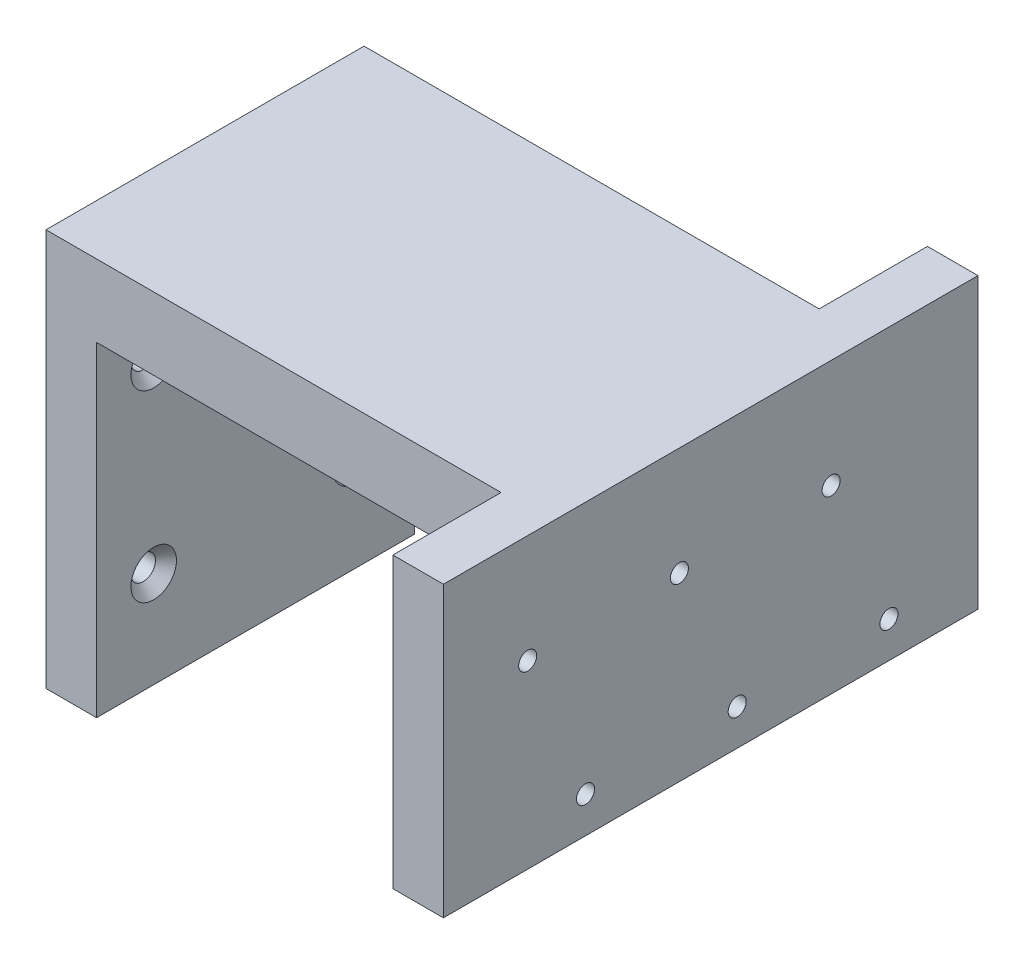
ISO-10303-21;
HEADER;
FILE_DESCRIPTION(('STEP AP214'),'2;1');
FILE_NAME('part.step','',(''),(''),'','','');
FILE_SCHEMA(('AUTOMOTIVE_DESIGN { 1 0 10303 214 1 1 1 1 }'));
ENDSEC;
DATA;
#1=APPLICATION_CONTEXT('core data for automotive mechanical design processes');
#2=APPLICATION_PROTOCOL_DEFINITION('international standard','automotive_design',2000,#1);
#3=PRODUCT_CONTEXT('',#1,'mechanical');
#4=PRODUCT('Part','Part','',(#3));
#5=PRODUCT_RELATED_PRODUCT_CATEGORY('part','',(#4));
#6=PRODUCT_DEFINITION_FORMATION('','',#4);
#7=PRODUCT_DEFINITION_CONTEXT('part definition',#1,'design');
#8=PRODUCT_DEFINITION('design','',#6,#7);
#9=PRODUCT_DEFINITION_SHAPE('','',#8);
#10=(LENGTH_UNIT() NAMED_UNIT(*) SI_UNIT(.MILLI.,.METRE.));
#11=(NAMED_UNIT(*) PLANE_ANGLE_UNIT() SI_UNIT($,.RADIAN.));
#12=(NAMED_UNIT(*) SI_UNIT($,.STERADIAN.) SOLID_ANGLE_UNIT());
#13=UNCERTAINTY_MEASURE_WITH_UNIT(LENGTH_MEASURE(1.E-05),#10,'distance_accuracy_value','');
#14=(GEOMETRIC_REPRESENTATION_CONTEXT(3) GLOBAL_UNCERTAINTY_ASSIGNED_CONTEXT((#13)) GLOBAL_UNIT_ASSIGNED_CONTEXT((#10,
#11,#12)) REPRESENTATION_CONTEXT('',''));
#15=CARTESIAN_POINT('',(0.,0.,0.));
#16=DIRECTION('',(0.,0.,1.));
#17=DIRECTION('',(1.,0.,0.));
#18=AXIS2_PLACEMENT_3D('',#15,#16,#17);
#19=CARTESIAN_POINT('',(0.,0.,74.));
#20=DIRECTION('',(1.,0.,0.));
#21=DIRECTION('',(0.,1.,0.));
#22=AXIS2_PLACEMENT_3D('',#19,#20,#21);
#23=PLANE('',#22);
#24=CARTESIAN_POINT('',(0.,13.3392612127427,51.1076544729571));
#25=DIRECTION('',(1.,0.,0.));
#26=DIRECTION('',(0.,1.,0.));
#27=AXIS2_PLACEMENT_3D('',#24,#25,#26);
#28=CIRCLE('',#27,1.69999999999999);
#29=CARTESIAN_POINT('',(0.,15.0392612127427,51.1076544729571));
#30=VERTEX_POINT('',#29);
#31=EDGE_CURVE('E48',#30,#30,#28,.T.);
#32=ORIENTED_EDGE('',*,*,#31,.T.);
#33=EDGE_LOOP('',(#32));
#34=FACE_BOUND('',#33,.T.);
#35=CARTESIAN_POINT('',(0.,38.7392612127427,51.1076544729571));
#36=DIRECTION('',(1.,0.,0.));
#37=DIRECTION('',(0.,1.,0.));
#38=AXIS2_PLACEMENT_3D('',#35,#36,#37);
#39=CIRCLE('',#38,1.69999999999999);
#40=CARTESIAN_POINT('',(0.,40.4392612127427,51.1076544729571));
#41=VERTEX_POINT('',#40);
#42=EDGE_CURVE('E291',#41,#41,#39,.T.);
#43=ORIENTED_EDGE('',*,*,#42,.T.);
#44=EDGE_LOOP('',(#43));
#45=FACE_BOUND('',#44,.T.);
#46=CARTESIAN_POINT('',(0.,13.3392612127428,23.1676544729571));
#47=DIRECTION('',(1.,0.,0.));
#48=DIRECTION('',(0.,1.,0.));
#49=AXIS2_PLACEMENT_3D('',#46,#47,#48);
#50=CIRCLE('',#49,1.69999999999999);
#51=CARTESIAN_POINT('',(0.,15.0392612127427,23.1676544729571));
#52=VERTEX_POINT('',#51);
#53=EDGE_CURVE('E286',#52,#52,#50,.T.);
#54=ORIENTED_EDGE('',*,*,#53,.T.);
#55=EDGE_LOOP('',(#54));
#56=FACE_BOUND('',#55,.T.);
#57=CARTESIAN_POINT('',(0.,38.7392612127427,23.1676544729571));
#58=DIRECTION('',(1.,0.,0.));
#59=DIRECTION('',(0.,1.,0.));
#60=AXIS2_PLACEMENT_3D('',#57,#58,#59);
#61=CIRCLE('',#60,1.69999999999999);
#62=CARTESIAN_POINT('',(0.,40.4392612127427,23.1676544729571));
#63=VERTEX_POINT('',#62);
#64=EDGE_CURVE('E168',#63,#63,#61,.T.);
#65=ORIENTED_EDGE('',*,*,#64,.T.);
#66=EDGE_LOOP('',(#65));
#67=FACE_BOUND('',#66,.T.);
#68=DIRECTION('',(0.,-1.,0.));
#69=VECTOR('',#68,1.);
#70=CARTESIAN_POINT('',(0.,0.,14.9857106713486));
#71=LINE('',#70,#69);
#72=CARTESIAN_POINT('',(0.,55.,14.9857106713486));
#73=VERTEX_POINT('',#72);
#74=CARTESIAN_POINT('',(0.,0.,14.9857106713486));
#75=VERTEX_POINT('',#74);
#76=EDGE_CURVE('E129',#73,#75,#71,.T.);
#77=ORIENTED_EDGE('',*,*,#76,.T.);
#78=DIRECTION('',(0.,0.,-1.));
#79=VECTOR('',#78,1.);
#80=CARTESIAN_POINT('',(0.,0.,74.));
#81=LINE('',#80,#79);
#82=CARTESIAN_POINT('',(0.,0.,59.0142893286514));
#83=VERTEX_POINT('',#82);
#84=EDGE_CURVE('E11',#83,#75,#81,.T.);
#85=ORIENTED_EDGE('',*,*,#84,.F.);
#86=DIRECTION('',(0.,-1.,0.));
#87=VECTOR('',#86,1.);
#88=CARTESIAN_POINT('',(0.,0.,59.0142893286514));
#89=LINE('',#88,#87);
#90=CARTESIAN_POINT('',(0.,55.,59.0142893286514));
#91=VERTEX_POINT('',#90);
#92=EDGE_CURVE('E162',#91,#83,#89,.T.);
#93=ORIENTED_EDGE('',*,*,#92,.F.);
#94=DIRECTION('',(0.,0.,-1.));
#95=VECTOR('',#94,1.);
#96=CARTESIAN_POINT('',(0.,55.,74.));
#97=LINE('',#96,#95);
#98=EDGE_CURVE('E273',#91,#73,#97,.T.);
#99=ORIENTED_EDGE('',*,*,#98,.T.);
#100=EDGE_LOOP('',(#77,#85,#93,#99));
#101=FACE_BOUND('',#100,.T.);
#102=ADVANCED_FACE('F45',(#34,#45,#56,#67,#101),#23,.F.);
#103=CARTESIAN_POINT('',(0.,0.,74.));
#104=DIRECTION('',(0.,1.,0.));
#105=DIRECTION('',(0.,0.,1.));
#106=AXIS2_PLACEMENT_3D('',#103,#104,#105);
#107=PLANE('',#106);
#108=DIRECTION('',(-1.,0.,0.));
#109=VECTOR('',#108,1.);
#110=CARTESIAN_POINT('',(63.,0.,14.9857106713486));
#111=LINE('',#110,#109);
#112=CARTESIAN_POINT('',(6.99999999999997,0.,14.9857106713486));
#113=VERTEX_POINT('',#112);
#114=EDGE_CURVE('E135',#113,#75,#111,.T.);
#115=ORIENTED_EDGE('',*,*,#114,.F.);
#116=DIRECTION('',(0.,0.,1.));
#117=VECTOR('',#116,1.);
#118=CARTESIAN_POINT('',(6.99999999999997,0.,0.));
#119=LINE('',#118,#117);
#120=CARTESIAN_POINT('',(6.99999999999997,0.,59.0142893286514));
#121=VERTEX_POINT('',#120);
#122=EDGE_CURVE('E242',#113,#121,#119,.T.);
#123=ORIENTED_EDGE('',*,*,#122,.T.);
#124=DIRECTION('',(-1.,0.,0.));
#125=VECTOR('',#124,1.);
#126=CARTESIAN_POINT('',(63.,0.,59.0142893286514));
#127=LINE('',#126,#125);
#128=EDGE_CURVE('E155',#121,#83,#127,.T.);
#129=ORIENTED_EDGE('',*,*,#128,.T.);
#130=ORIENTED_EDGE('',*,*,#84,.T.);
#131=EDGE_LOOP('',(#115,#123,#129,#130));
#132=FACE_BOUND('',#131,.T.);
#133=ADVANCED_FACE('F346',(#132),#107,.F.);
#134=CARTESIAN_POINT('',(0.,55.,74.));
#135=DIRECTION('',(0.,-1.,0.));
#136=DIRECTION('',(0.,0.,-1.));
#137=AXIS2_PLACEMENT_3D('',#134,#135,#136);
#138=PLANE('',#137);
#139=DIRECTION('',(-1.,0.,0.));
#140=VECTOR('',#139,1.);
#141=CARTESIAN_POINT('',(63.,55.,14.9857106713486));
#142=LINE('',#141,#140);
#143=CARTESIAN_POINT('',(63.,55.,14.9857106713486));
#144=VERTEX_POINT('',#143);
#145=EDGE_CURVE('E123',#144,#73,#142,.T.);
#146=ORIENTED_EDGE('',*,*,#145,.T.);
#147=ORIENTED_EDGE('',*,*,#98,.F.);
#148=DIRECTION('',(-1.,0.,0.));
#149=VECTOR('',#148,1.);
#150=CARTESIAN_POINT('',(63.,55.,59.0142893286514));
#151=LINE('',#150,#149);
#152=CARTESIAN_POINT('',(63.,55.,59.0142893286514));
#153=VERTEX_POINT('',#152);
#154=EDGE_CURVE('E165',#153,#91,#151,.T.);
#155=ORIENTED_EDGE('',*,*,#154,.F.);
#156=DIRECTION('',(0.,0.,-1.));
#157=VECTOR('',#156,1.);
#158=CARTESIAN_POINT('',(63.,55.,0.));
#159=LINE('',#158,#157);
#160=CARTESIAN_POINT('',(63.,55.,74.));
#161=VERTEX_POINT('',#160);
#162=EDGE_CURVE('E159',#161,#153,#159,.T.);
#163=ORIENTED_EDGE('',*,*,#162,.F.);
#164=DIRECTION('',(-1.,0.,0.));
#165=VECTOR('',#164,1.);
#166=CARTESIAN_POINT('',(0.,55.,74.));
#167=LINE('',#166,#165);
#168=CARTESIAN_POINT('',(70.,55.,74.));
#169=VERTEX_POINT('',#168);
#170=EDGE_CURVE('E269',#169,#161,#167,.T.);
#171=ORIENTED_EDGE('',*,*,#170,.F.);
#172=DIRECTION('',(0.,0.,-1.));
#173=VECTOR('',#172,1.);
#174=CARTESIAN_POINT('',(70.,55.,74.));
#175=LINE('',#174,#173);
#176=CARTESIAN_POINT('',(70.,55.,0.));
#177=VERTEX_POINT('',#176);
#178=EDGE_CURVE('E54',#169,#177,#175,.T.);
#179=ORIENTED_EDGE('',*,*,#178,.T.);
#180=DIRECTION('',(-1.,0.,0.));
#181=VECTOR('',#180,1.);
#182=CARTESIAN_POINT('',(0.,55.,0.));
#183=LINE('',#182,#181);
#184=CARTESIAN_POINT('',(63.,55.,0.));
#185=VERTEX_POINT('',#184);
#186=EDGE_CURVE('E148',#177,#185,#183,.T.);
#187=ORIENTED_EDGE('',*,*,#186,.T.);
#188=DIRECTION('',(0.,0.,-1.));
#189=VECTOR('',#188,1.);
#190=CARTESIAN_POINT('',(63.,55.,0.));
#191=LINE('',#190,#189);
#192=EDGE_CURVE('E136',#144,#185,#191,.T.);
#193=ORIENTED_EDGE('',*,*,#192,.F.);
#194=EDGE_LOOP('',(#146,#147,#155,#163,#171,#179,#187,#193));
#195=FACE_BOUND('',#194,.T.);
#196=ADVANCED_FACE('F145',(#195),#138,.F.);
#197=CARTESIAN_POINT('',(0.,0.,74.));
#198=DIRECTION('',(0.,0.,-1.));
#199=DIRECTION('',(-1.,0.,0.));
#200=AXIS2_PLACEMENT_3D('',#197,#198,#199);
#201=PLANE('',#200);
#202=ORIENTED_EDGE('',*,*,#170,.T.);
#203=DIRECTION('',(0.,-1.,0.));
#204=VECTOR('',#203,1.);
#205=CARTESIAN_POINT('',(63.,0.,74.));
#206=LINE('',#205,#204);
#207=CARTESIAN_POINT('',(63.,15.,74.));
#208=VERTEX_POINT('',#207);
#209=EDGE_CURVE('E261',#161,#208,#206,.T.);
#210=ORIENTED_EDGE('',*,*,#209,.T.);
#211=DIRECTION('',(1.,0.,0.));
#212=VECTOR('',#211,1.);
#213=CARTESIAN_POINT('',(0.,15.,74.));
#214=LINE('',#213,#212);
#215=CARTESIAN_POINT('',(70.,15.,74.));
#216=VERTEX_POINT('',#215);
#217=EDGE_CURVE('E246',#208,#216,#214,.T.);
#218=ORIENTED_EDGE('',*,*,#217,.T.);
#219=DIRECTION('',(0.,1.,0.));
#220=VECTOR('',#219,1.);
#221=CARTESIAN_POINT('',(70.,0.,74.));
#222=LINE('',#221,#220);
#223=EDGE_CURVE('E266',#216,#169,#222,.T.);
#224=ORIENTED_EDGE('',*,*,#223,.T.);
#225=EDGE_LOOP('',(#202,#210,#218,#224));
#226=FACE_BOUND('',#225,.T.);
#227=ADVANCED_FACE('F354',(#226),#201,.F.);
#228=CARTESIAN_POINT('',(0.,0.,0.));
#229=DIRECTION('',(0.,0.,-1.));
#230=DIRECTION('',(-1.,0.,0.));
#231=AXIS2_PLACEMENT_3D('',#228,#229,#230);
#232=PLANE('',#231);
#233=DIRECTION('',(0.,1.,0.));
#234=VECTOR('',#233,1.);
#235=CARTESIAN_POINT('',(63.,45.,0.));
#236=LINE('',#235,#234);
#237=CARTESIAN_POINT('',(63.,15.,0.));
#238=VERTEX_POINT('',#237);
#239=EDGE_CURVE('E69',#238,#185,#236,.T.);
#240=ORIENTED_EDGE('',*,*,#239,.T.);
#241=ORIENTED_EDGE('',*,*,#186,.F.);
#242=DIRECTION('',(0.,1.,0.));
#243=VECTOR('',#242,1.);
#244=CARTESIAN_POINT('',(70.,0.,0.));
#245=LINE('',#244,#243);
#246=CARTESIAN_POINT('',(70.,15.,0.));
#247=VERTEX_POINT('',#246);
#248=EDGE_CURVE('E265',#247,#177,#245,.T.);
#249=ORIENTED_EDGE('',*,*,#248,.F.);
#250=DIRECTION('',(-1.,0.,0.));
#251=VECTOR('',#250,1.);
#252=CARTESIAN_POINT('',(63.,15.,0.));
#253=LINE('',#252,#251);
#254=EDGE_CURVE('E197',#247,#238,#253,.T.);
#255=ORIENTED_EDGE('',*,*,#254,.T.);
#256=EDGE_LOOP('',(#240,#241,#249,#255));
#257=FACE_BOUND('',#256,.T.);
#258=ADVANCED_FACE('F335',(#257),#232,.T.);
#259=CARTESIAN_POINT('',(6.99999999999997,0.,0.));
#260=DIRECTION('',(-1.,0.,0.));
#261=DIRECTION('',(0.,0.,1.));
#262=AXIS2_PLACEMENT_3D('',#259,#260,#261);
#263=PLANE('',#262);
#264=CARTESIAN_POINT('',(6.99999999999997,13.3392612127427,51.1076544729571));
#265=DIRECTION('',(1.,0.,0.));
#266=DIRECTION('',(0.,0.,-1.));
#267=AXIS2_PLACEMENT_3D('',#264,#265,#266);
#268=CIRCLE('',#267,3.15);
#269=CARTESIAN_POINT('',(6.99999999999997,13.3392612127427,47.9576544729571));
#270=VERTEX_POINT('',#269);
#271=EDGE_CURVE('E597',#270,#270,#268,.T.);
#272=ORIENTED_EDGE('',*,*,#271,.F.);
#273=EDGE_LOOP('',(#272));
#274=FACE_BOUND('',#273,.T.);
#275=CARTESIAN_POINT('',(6.99999999999997,38.7392612127427,51.1076544729571));
#276=DIRECTION('',(1.,0.,0.));
#277=DIRECTION('',(0.,0.,-1.));
#278=AXIS2_PLACEMENT_3D('',#275,#276,#277);
#279=CIRCLE('',#278,3.15);
#280=CARTESIAN_POINT('',(6.99999999999997,38.7392612127427,47.9576544729571));
#281=VERTEX_POINT('',#280);
#282=EDGE_CURVE('E303',#281,#281,#279,.T.);
#283=ORIENTED_EDGE('',*,*,#282,.F.);
#284=EDGE_LOOP('',(#283));
#285=FACE_BOUND('',#284,.T.);
#286=CARTESIAN_POINT('',(6.99999999999997,13.3392612127428,23.1676544729571));
#287=DIRECTION('',(1.,0.,0.));
#288=DIRECTION('',(0.,0.,-1.));
#289=AXIS2_PLACEMENT_3D('',#286,#287,#288);
#290=CIRCLE('',#289,3.15);
#291=CARTESIAN_POINT('',(6.99999999999997,13.3392612127428,20.0176544729571));
#292=VERTEX_POINT('',#291);
#293=EDGE_CURVE('E294',#292,#292,#290,.T.);
#294=ORIENTED_EDGE('',*,*,#293,.F.);
#295=EDGE_LOOP('',(#294));
#296=FACE_BOUND('',#295,.T.);
#297=CARTESIAN_POINT('',(6.99999999999997,38.7392612127427,23.1676544729571));
#298=DIRECTION('',(1.,0.,0.));
#299=DIRECTION('',(0.,0.,-1.));
#300=AXIS2_PLACEMENT_3D('',#297,#298,#299);
#301=CIRCLE('',#300,3.15);
#302=CARTESIAN_POINT('',(6.99999999999997,38.7392612127427,20.0176544729571));
#303=VERTEX_POINT('',#302);
#304=EDGE_CURVE('E289',#303,#303,#301,.T.);
#305=ORIENTED_EDGE('',*,*,#304,.F.);
#306=EDGE_LOOP('',(#305));
#307=FACE_BOUND('',#306,.T.);
#308=DIRECTION('',(0.,-1.,0.));
#309=VECTOR('',#308,1.);
#310=CARTESIAN_POINT('',(6.99999999999997,0.,14.9857106713486));
#311=LINE('',#310,#309);
#312=CARTESIAN_POINT('',(6.99999999999997,45.,14.9857106713486));
#313=VERTEX_POINT('',#312);
#314=EDGE_CURVE('E184',#313,#113,#311,.T.);
#315=ORIENTED_EDGE('',*,*,#314,.F.);
#316=DIRECTION('',(0.,0.,1.));
#317=VECTOR('',#316,1.);
#318=CARTESIAN_POINT('',(6.99999999999997,45.,0.));
#319=LINE('',#318,#317);
#320=CARTESIAN_POINT('',(6.99999999999997,45.,59.0142893286514));
#321=VERTEX_POINT('',#320);
#322=EDGE_CURVE('E247',#313,#321,#319,.T.);
#323=ORIENTED_EDGE('',*,*,#322,.T.);
#324=DIRECTION('',(0.,-1.,0.));
#325=VECTOR('',#324,1.);
#326=CARTESIAN_POINT('',(6.99999999999997,0.,59.0142893286514));
#327=LINE('',#326,#325);
#328=EDGE_CURVE('E177',#321,#121,#327,.T.);
#329=ORIENTED_EDGE('',*,*,#328,.T.);
#330=ORIENTED_EDGE('',*,*,#122,.F.);
#331=EDGE_LOOP('',(#315,#323,#329,#330));
#332=FACE_BOUND('',#331,.T.);
#333=ADVANCED_FACE('F331',(#274,#285,#296,#307,#332),#263,.F.);
#334=CARTESIAN_POINT('',(6.99999999999997,45.,0.));
#335=DIRECTION('',(0.,1.,0.));
#336=DIRECTION('',(0.,0.,1.));
#337=AXIS2_PLACEMENT_3D('',#334,#335,#336);
#338=PLANE('',#337);
#339=DIRECTION('',(-1.,0.,0.));
#340=VECTOR('',#339,1.);
#341=CARTESIAN_POINT('',(6.99999999999997,45.,14.9857106713486));
#342=LINE('',#341,#340);
#343=CARTESIAN_POINT('',(63.,45.,14.9857106713486));
#344=VERTEX_POINT('',#343);
#345=EDGE_CURVE('E181',#344,#313,#342,.T.);
#346=ORIENTED_EDGE('',*,*,#345,.F.);
#347=DIRECTION('',(0.,0.,1.));
#348=VECTOR('',#347,1.);
#349=CARTESIAN_POINT('',(63.,45.,0.));
#350=LINE('',#349,#348);
#351=CARTESIAN_POINT('',(63.,45.,59.0142893286514));
#352=VERTEX_POINT('',#351);
#353=EDGE_CURVE('E142',#344,#352,#350,.T.);
#354=ORIENTED_EDGE('',*,*,#353,.T.);
#355=DIRECTION('',(-1.,0.,0.));
#356=VECTOR('',#355,1.);
#357=CARTESIAN_POINT('',(6.99999999999997,45.,59.0142893286514));
#358=LINE('',#357,#356);
#359=EDGE_CURVE('E157',#352,#321,#358,.T.);
#360=ORIENTED_EDGE('',*,*,#359,.T.);
#361=ORIENTED_EDGE('',*,*,#322,.F.);
#362=EDGE_LOOP('',(#346,#354,#360,#361));
#363=FACE_BOUND('',#362,.T.);
#364=ADVANCED_FACE('F334',(#363),#338,.F.);
#365=CARTESIAN_POINT('',(70.,0.,74.));
#366=DIRECTION('',(-1.,0.,0.));
#367=DIRECTION('',(0.,-1.,0.));
#368=AXIS2_PLACEMENT_3D('',#365,#366,#367);
#369=PLANE('',#368);
#370=CARTESIAN_POINT('',(70.,40.,62.3317645611481));
#371=DIRECTION('',(1.,0.,0.));
#372=DIRECTION('',(0.,1.,0.));
#373=AXIS2_PLACEMENT_3D('',#370,#371,#372);
#374=CIRCLE('',#373,1.25);
#375=CARTESIAN_POINT('',(70.,41.25,62.3317645611481));
#376=VERTEX_POINT('',#375);
#377=EDGE_CURVE('E192',#376,#376,#374,.T.);
#378=ORIENTED_EDGE('',*,*,#377,.F.);
#379=EDGE_LOOP('',(#378));
#380=FACE_BOUND('',#379,.T.);
#381=CARTESIAN_POINT('',(70.,20.,54.3317645611481));
#382=DIRECTION('',(1.,0.,0.));
#383=DIRECTION('',(0.,1.,0.));
#384=AXIS2_PLACEMENT_3D('',#381,#382,#383);
#385=CIRCLE('',#384,1.25000000000001);
#386=CARTESIAN_POINT('',(70.,21.25,54.3317645611481));
#387=VERTEX_POINT('',#386);
#388=EDGE_CURVE('E193',#387,#387,#385,.T.);
#389=ORIENTED_EDGE('',*,*,#388,.F.);
#390=EDGE_LOOP('',(#389));
#391=FACE_BOUND('',#390,.T.);
#392=CARTESIAN_POINT('',(70.,40.,41.3317645611481));
#393=DIRECTION('',(1.,0.,0.));
#394=DIRECTION('',(0.,1.,0.));
#395=AXIS2_PLACEMENT_3D('',#392,#393,#394);
#396=CIRCLE('',#395,1.25);
#397=CARTESIAN_POINT('',(70.,41.25,41.3317645611481));
#398=VERTEX_POINT('',#397);
#399=EDGE_CURVE('E202',#398,#398,#396,.T.);
#400=ORIENTED_EDGE('',*,*,#399,.F.);
#401=EDGE_LOOP('',(#400));
#402=FACE_BOUND('',#401,.T.);
#403=CARTESIAN_POINT('',(70.,20.,33.3317645611481));
#404=DIRECTION('',(1.,0.,0.));
#405=DIRECTION('',(0.,1.,0.));
#406=AXIS2_PLACEMENT_3D('',#403,#404,#405);
#407=CIRCLE('',#406,1.25000000000001);
#408=CARTESIAN_POINT('',(70.,21.25,33.3317645611481));
#409=VERTEX_POINT('',#408);
#410=EDGE_CURVE('E210',#409,#409,#407,.T.);
#411=ORIENTED_EDGE('',*,*,#410,.F.);
#412=EDGE_LOOP('',(#411));
#413=FACE_BOUND('',#412,.T.);
#414=CARTESIAN_POINT('',(70.,40.,20.3317645611481));
#415=DIRECTION('',(1.,0.,0.));
#416=DIRECTION('',(0.,1.,0.));
#417=AXIS2_PLACEMENT_3D('',#414,#415,#416);
#418=CIRCLE('',#417,1.25);
#419=CARTESIAN_POINT('',(70.,41.25,20.3317645611481));
#420=VERTEX_POINT('',#419);
#421=EDGE_CURVE('E218',#420,#420,#418,.T.);
#422=ORIENTED_EDGE('',*,*,#421,.F.);
#423=EDGE_LOOP('',(#422));
#424=FACE_BOUND('',#423,.T.);
#425=CARTESIAN_POINT('',(70.,20.,12.3317645611481));
#426=DIRECTION('',(1.,0.,0.));
#427=DIRECTION('',(0.,1.,0.));
#428=AXIS2_PLACEMENT_3D('',#425,#426,#427);
#429=CIRCLE('',#428,1.25000000000001);
#430=CARTESIAN_POINT('',(70.,21.25,12.3317645611481));
#431=VERTEX_POINT('',#430);
#432=EDGE_CURVE('E226',#431,#431,#429,.T.);
#433=ORIENTED_EDGE('',*,*,#432,.F.);
#434=EDGE_LOOP('',(#433));
#435=FACE_BOUND('',#434,.T.);
#436=ORIENTED_EDGE('',*,*,#223,.F.);
#437=DIRECTION('',(0.,0.,1.));
#438=VECTOR('',#437,1.);
#439=CARTESIAN_POINT('',(70.,15.,0.));
#440=LINE('',#439,#438);
#441=EDGE_CURVE('E241',#247,#216,#440,.T.);
#442=ORIENTED_EDGE('',*,*,#441,.F.);
#443=ORIENTED_EDGE('',*,*,#248,.T.);
#444=ORIENTED_EDGE('',*,*,#178,.F.);
#445=EDGE_LOOP('',(#436,#442,#443,#444));
#446=FACE_BOUND('',#445,.T.);
#447=ADVANCED_FACE('F360',(#380,#391,#402,#413,#424,#435,#446),#369,.F.);
#448=CARTESIAN_POINT('',(63.,45.,0.));
#449=DIRECTION('',(1.,0.,0.));
#450=DIRECTION('',(0.,0.,-1.));
#451=AXIS2_PLACEMENT_3D('',#448,#449,#450);
#452=PLANE('',#451);
#453=CARTESIAN_POINT('',(63.,20.,12.3317645611481));
#454=DIRECTION('',(1.,0.,0.));
#455=DIRECTION('',(0.,0.,-1.));
#456=AXIS2_PLACEMENT_3D('',#453,#454,#455);
#457=CIRCLE('',#456,1.25000000000001);
#458=CARTESIAN_POINT('',(63.,20.,11.0817645611481));
#459=VERTEX_POINT('',#458);
#460=EDGE_CURVE('E187',#459,#459,#457,.F.);
#461=ORIENTED_EDGE('',*,*,#460,.F.);
#462=EDGE_LOOP('',(#461));
#463=FACE_BOUND('',#462,.T.);
#464=DIRECTION('',(0.,0.,1.));
#465=VECTOR('',#464,1.);
#466=CARTESIAN_POINT('',(63.,15.,0.));
#467=LINE('',#466,#465);
#468=EDGE_CURVE('E253',#238,#208,#467,.T.);
#469=ORIENTED_EDGE('',*,*,#468,.T.);
#470=ORIENTED_EDGE('',*,*,#209,.F.);
#471=ORIENTED_EDGE('',*,*,#162,.T.);
#472=DIRECTION('',(0.,-1.,0.));
#473=VECTOR('',#472,1.);
#474=CARTESIAN_POINT('',(63.,0.,59.0142893286514));
#475=LINE('',#474,#473);
#476=EDGE_CURVE('E62',#153,#352,#475,.T.);
#477=ORIENTED_EDGE('',*,*,#476,.T.);
#478=ORIENTED_EDGE('',*,*,#353,.F.);
#479=DIRECTION('',(0.,-1.,0.));
#480=VECTOR('',#479,1.);
#481=CARTESIAN_POINT('',(63.,0.,14.9857106713486));
#482=LINE('',#481,#480);
#483=EDGE_CURVE('E126',#144,#344,#482,.T.);
#484=ORIENTED_EDGE('',*,*,#483,.F.);
#485=ORIENTED_EDGE('',*,*,#192,.T.);
#486=ORIENTED_EDGE('',*,*,#239,.F.);
#487=EDGE_LOOP('',(#469,#470,#471,#477,#478,#484,#485,#486));
#488=FACE_BOUND('',#487,.T.);
#489=CARTESIAN_POINT('',(63.,40.,62.3317645611481));
#490=DIRECTION('',(1.,0.,0.));
#491=DIRECTION('',(0.,0.,-1.));
#492=AXIS2_PLACEMENT_3D('',#489,#490,#491);
#493=CIRCLE('',#492,1.25);
#494=CARTESIAN_POINT('',(63.,40.,61.0817645611481));
#495=VERTEX_POINT('',#494);
#496=EDGE_CURVE('E188',#495,#495,#493,.F.);
#497=ORIENTED_EDGE('',*,*,#496,.F.);
#498=EDGE_LOOP('',(#497));
#499=FACE_BOUND('',#498,.T.);
#500=CARTESIAN_POINT('',(63.,40.,20.3317645611481));
#501=DIRECTION('',(1.,0.,0.));
#502=DIRECTION('',(0.,0.,-1.));
#503=AXIS2_PLACEMENT_3D('',#500,#501,#502);
#504=CIRCLE('',#503,1.25);
#505=CARTESIAN_POINT('',(63.,40.,19.0817645611481));
#506=VERTEX_POINT('',#505);
#507=EDGE_CURVE('E222',#506,#506,#504,.F.);
#508=ORIENTED_EDGE('',*,*,#507,.F.);
#509=EDGE_LOOP('',(#508));
#510=FACE_BOUND('',#509,.T.);
#511=CARTESIAN_POINT('',(63.,20.,33.3317645611481));
#512=DIRECTION('',(1.,0.,0.));
#513=DIRECTION('',(0.,0.,-1.));
#514=AXIS2_PLACEMENT_3D('',#511,#512,#513);
#515=CIRCLE('',#514,1.25000000000001);
#516=CARTESIAN_POINT('',(63.,20.,32.0817645611481));
#517=VERTEX_POINT('',#516);
#518=EDGE_CURVE('E214',#517,#517,#515,.F.);
#519=ORIENTED_EDGE('',*,*,#518,.F.);
#520=EDGE_LOOP('',(#519));
#521=FACE_BOUND('',#520,.T.);
#522=CARTESIAN_POINT('',(63.,40.,41.3317645611481));
#523=DIRECTION('',(1.,0.,0.));
#524=DIRECTION('',(0.,0.,-1.));
#525=AXIS2_PLACEMENT_3D('',#522,#523,#524);
#526=CIRCLE('',#525,1.25);
#527=CARTESIAN_POINT('',(63.,40.,40.0817645611481));
#528=VERTEX_POINT('',#527);
#529=EDGE_CURVE('E206',#528,#528,#526,.F.);
#530=ORIENTED_EDGE('',*,*,#529,.F.);
#531=EDGE_LOOP('',(#530));
#532=FACE_BOUND('',#531,.T.);
#533=CARTESIAN_POINT('',(63.,20.,54.3317645611481));
#534=DIRECTION('',(1.,0.,0.));
#535=DIRECTION('',(0.,0.,-1.));
#536=AXIS2_PLACEMENT_3D('',#533,#534,#535);
#537=CIRCLE('',#536,1.25000000000001);
#538=CARTESIAN_POINT('',(63.,20.,53.0817645611481));
#539=VERTEX_POINT('',#538);
#540=EDGE_CURVE('E198',#539,#539,#537,.F.);
#541=ORIENTED_EDGE('',*,*,#540,.F.);
#542=EDGE_LOOP('',(#541));
#543=FACE_BOUND('',#542,.T.);
#544=ADVANCED_FACE('F138',(#463,#488,#499,#510,#521,#532,#543),#452,.F.);
#545=CARTESIAN_POINT('',(63.,15.,0.));
#546=DIRECTION('',(0.,1.,0.));
#547=DIRECTION('',(0.,0.,1.));
#548=AXIS2_PLACEMENT_3D('',#545,#546,#547);
#549=PLANE('',#548);
#550=ORIENTED_EDGE('',*,*,#468,.F.);
#551=ORIENTED_EDGE('',*,*,#254,.F.);
#552=ORIENTED_EDGE('',*,*,#441,.T.);
#553=ORIENTED_EDGE('',*,*,#217,.F.);
#554=EDGE_LOOP('',(#550,#551,#552,#553));
#555=FACE_BOUND('',#554,.T.);
#556=ADVANCED_FACE('F364',(#555),#549,.F.);
#557=CARTESIAN_POINT('',(59.4644660940672,20.,12.3317645611481));
#558=DIRECTION('',(1.,0.,0.));
#559=DIRECTION('',(0.,1.,0.));
#560=AXIS2_PLACEMENT_3D('',#557,#558,#559);
#561=CYLINDRICAL_SURFACE('',#560,1.25000000000001);
#562=ORIENTED_EDGE('',*,*,#460,.T.);
#563=EDGE_LOOP('',(#562));
#564=FACE_BOUND('',#563,.T.);
#565=ORIENTED_EDGE('',*,*,#432,.T.);
#566=EDGE_LOOP('',(#565));
#567=FACE_BOUND('',#566,.T.);
#568=ADVANCED_FACE('F366',(#564,#567),#561,.F.);
#569=CARTESIAN_POINT('',(59.4644660940672,40.,20.3317645611481));
#570=DIRECTION('',(1.,0.,0.));
#571=DIRECTION('',(0.,1.,0.));
#572=AXIS2_PLACEMENT_3D('',#569,#570,#571);
#573=CYLINDRICAL_SURFACE('',#572,1.25);
#574=ORIENTED_EDGE('',*,*,#507,.T.);
#575=EDGE_LOOP('',(#574));
#576=FACE_BOUND('',#575,.T.);
#577=ORIENTED_EDGE('',*,*,#421,.T.);
#578=EDGE_LOOP('',(#577));
#579=FACE_BOUND('',#578,.T.);
#580=ADVANCED_FACE('F373',(#576,#579),#573,.F.);
#581=CARTESIAN_POINT('',(59.4644660940672,20.,33.3317645611481));
#582=DIRECTION('',(1.,0.,0.));
#583=DIRECTION('',(0.,1.,0.));
#584=AXIS2_PLACEMENT_3D('',#581,#582,#583);
#585=CYLINDRICAL_SURFACE('',#584,1.25000000000001);
#586=ORIENTED_EDGE('',*,*,#518,.T.);
#587=EDGE_LOOP('',(#586));
#588=FACE_BOUND('',#587,.T.);
#589=ORIENTED_EDGE('',*,*,#410,.T.);
#590=EDGE_LOOP('',(#589));
#591=FACE_BOUND('',#590,.T.);
#592=ADVANCED_FACE('F410',(#588,#591),#585,.F.);
#593=CARTESIAN_POINT('',(59.4644660940672,40.,41.3317645611481));
#594=DIRECTION('',(1.,0.,0.));
#595=DIRECTION('',(0.,1.,0.));
#596=AXIS2_PLACEMENT_3D('',#593,#594,#595);
#597=CYLINDRICAL_SURFACE('',#596,1.25);
#598=ORIENTED_EDGE('',*,*,#529,.T.);
#599=EDGE_LOOP('',(#598));
#600=FACE_BOUND('',#599,.T.);
#601=ORIENTED_EDGE('',*,*,#399,.T.);
#602=EDGE_LOOP('',(#601));
#603=FACE_BOUND('',#602,.T.);
#604=ADVANCED_FACE('F406',(#600,#603),#597,.F.);
#605=CARTESIAN_POINT('',(59.4644660940672,20.,54.3317645611481));
#606=DIRECTION('',(1.,0.,0.));
#607=DIRECTION('',(0.,1.,0.));
#608=AXIS2_PLACEMENT_3D('',#605,#606,#607);
#609=CYLINDRICAL_SURFACE('',#608,1.25000000000001);
#610=ORIENTED_EDGE('',*,*,#540,.T.);
#611=EDGE_LOOP('',(#610));
#612=FACE_BOUND('',#611,.T.);
#613=ORIENTED_EDGE('',*,*,#388,.T.);
#614=EDGE_LOOP('',(#613));
#615=FACE_BOUND('',#614,.T.);
#616=ADVANCED_FACE('F402',(#612,#615),#609,.F.);
#617=CARTESIAN_POINT('',(59.4644660940672,40.,62.3317645611481));
#618=DIRECTION('',(1.,0.,0.));
#619=DIRECTION('',(0.,1.,0.));
#620=AXIS2_PLACEMENT_3D('',#617,#618,#619);
#621=CYLINDRICAL_SURFACE('',#620,1.25);
#622=ORIENTED_EDGE('',*,*,#496,.T.);
#623=EDGE_LOOP('',(#622));
#624=FACE_BOUND('',#623,.T.);
#625=ORIENTED_EDGE('',*,*,#377,.T.);
#626=EDGE_LOOP('',(#625));
#627=FACE_BOUND('',#626,.T.);
#628=ADVANCED_FACE('F399',(#624,#627),#621,.F.);
#629=CARTESIAN_POINT('',(63.,0.,59.0142893286514));
#630=DIRECTION('',(0.,0.,-1.));
#631=DIRECTION('',(-1.,0.,0.));
#632=AXIS2_PLACEMENT_3D('',#629,#630,#631);
#633=PLANE('',#632);
#634=ORIENTED_EDGE('',*,*,#359,.F.);
#635=ORIENTED_EDGE('',*,*,#476,.F.);
#636=ORIENTED_EDGE('',*,*,#154,.T.);
#637=ORIENTED_EDGE('',*,*,#92,.T.);
#638=ORIENTED_EDGE('',*,*,#128,.F.);
#639=ORIENTED_EDGE('',*,*,#328,.F.);
#640=EDGE_LOOP('',(#634,#635,#636,#637,#638,#639));
#641=FACE_BOUND('',#640,.T.);
#642=ADVANCED_FACE('F344',(#641),#633,.F.);
#643=CARTESIAN_POINT('',(63.,0.,14.9857106713486));
#644=DIRECTION('',(0.,0.,-1.));
#645=DIRECTION('',(-1.,0.,0.));
#646=AXIS2_PLACEMENT_3D('',#643,#644,#645);
#647=PLANE('',#646);
#648=ORIENTED_EDGE('',*,*,#314,.T.);
#649=ORIENTED_EDGE('',*,*,#114,.T.);
#650=ORIENTED_EDGE('',*,*,#76,.F.);
#651=ORIENTED_EDGE('',*,*,#145,.F.);
#652=ORIENTED_EDGE('',*,*,#483,.T.);
#653=ORIENTED_EDGE('',*,*,#345,.T.);
#654=EDGE_LOOP('',(#648,#649,#650,#651,#652,#653));
#655=FACE_BOUND('',#654,.T.);
#656=ADVANCED_FACE('F125',(#655),#647,.T.);
#657=CARTESIAN_POINT('',(6.99999999999997,38.7392612127427,23.1676544729571));
#658=DIRECTION('',(1.,0.,0.));
#659=DIRECTION('',(0.,0.,-1.));
#660=AXIS2_PLACEMENT_3D('',#657,#658,#659);
#661=CYLINDRICAL_SURFACE('',#660,1.69999999999999);
#662=CARTESIAN_POINT('',(5.54999999999997,38.7392612127427,23.1676544729571));
#663=DIRECTION('',(1.,0.,0.));
#664=DIRECTION('',(0.,0.,-1.));
#665=AXIS2_PLACEMENT_3D('',#662,#663,#664);
#666=CIRCLE('',#665,1.69999999999999);
#667=CARTESIAN_POINT('',(5.54999999999997,38.7392612127427,21.4676544729571));
#668=VERTEX_POINT('',#667);
#669=EDGE_CURVE('E285',#668,#668,#666,.T.);
#670=ORIENTED_EDGE('',*,*,#669,.T.);
#671=EDGE_LOOP('',(#670));
#672=FACE_BOUND('',#671,.T.);
#673=ORIENTED_EDGE('',*,*,#64,.F.);
#674=EDGE_LOOP('',(#673));
#675=FACE_BOUND('',#674,.T.);
#676=ADVANCED_FACE('F321',(#672,#675),#661,.F.);
#677=CARTESIAN_POINT('',(6.99999999999997,38.7392612127427,23.1676544729571));
#678=DIRECTION('',(1.,0.,0.));
#679=DIRECTION('',(0.,0.,-1.));
#680=AXIS2_PLACEMENT_3D('',#677,#678,#679);
#681=CONICAL_SURFACE('',#680,3.15,0.78539816339745);
#682=ORIENTED_EDGE('',*,*,#669,.F.);
#683=EDGE_LOOP('',(#682));
#684=FACE_BOUND('',#683,.T.);
#685=ORIENTED_EDGE('',*,*,#304,.T.);
#686=EDGE_LOOP('',(#685));
#687=FACE_BOUND('',#686,.T.);
#688=ADVANCED_FACE('F324',(#684,#687),#681,.F.);
#689=CARTESIAN_POINT('',(6.99999999999997,13.3392612127428,23.1676544729571));
#690=DIRECTION('',(1.,0.,0.));
#691=DIRECTION('',(0.,0.,-1.));
#692=AXIS2_PLACEMENT_3D('',#689,#690,#691);
#693=CYLINDRICAL_SURFACE('',#692,1.69999999999999);
#694=CARTESIAN_POINT('',(5.54999999999997,13.3392612127428,23.1676544729571));
#695=DIRECTION('',(1.,0.,0.));
#696=DIRECTION('',(0.,0.,-1.));
#697=AXIS2_PLACEMENT_3D('',#694,#695,#696);
#698=CIRCLE('',#697,1.69999999999999);
#699=CARTESIAN_POINT('',(5.54999999999997,13.3392612127428,21.4676544729571));
#700=VERTEX_POINT('',#699);
#701=EDGE_CURVE('E290',#700,#700,#698,.T.);
#702=ORIENTED_EDGE('',*,*,#701,.T.);
#703=EDGE_LOOP('',(#702));
#704=FACE_BOUND('',#703,.T.);
#705=ORIENTED_EDGE('',*,*,#53,.F.);
#706=EDGE_LOOP('',(#705));
#707=FACE_BOUND('',#706,.T.);
#708=ADVANCED_FACE('F327',(#704,#707),#693,.F.);
#709=CARTESIAN_POINT('',(6.99999999999997,13.3392612127428,23.1676544729571));
#710=DIRECTION('',(1.,0.,0.));
#711=DIRECTION('',(0.,0.,-1.));
#712=AXIS2_PLACEMENT_3D('',#709,#710,#711);
#713=CONICAL_SURFACE('',#712,3.15,0.78539816339745);
#714=ORIENTED_EDGE('',*,*,#701,.F.);
#715=EDGE_LOOP('',(#714));
#716=FACE_BOUND('',#715,.T.);
#717=ORIENTED_EDGE('',*,*,#293,.T.);
#718=EDGE_LOOP('',(#717));
#719=FACE_BOUND('',#718,.T.);
#720=ADVANCED_FACE('F540',(#716,#719),#713,.F.);
#721=CARTESIAN_POINT('',(6.99999999999997,38.7392612127427,51.1076544729571));
#722=DIRECTION('',(1.,0.,0.));
#723=DIRECTION('',(0.,0.,-1.));
#724=AXIS2_PLACEMENT_3D('',#721,#722,#723);
#725=CYLINDRICAL_SURFACE('',#724,1.69999999999999);
#726=CARTESIAN_POINT('',(5.54999999999997,38.7392612127427,51.1076544729571));
#727=DIRECTION('',(1.,0.,0.));
#728=DIRECTION('',(0.,0.,-1.));
#729=AXIS2_PLACEMENT_3D('',#726,#727,#728);
#730=CIRCLE('',#729,1.69999999999999);
#731=CARTESIAN_POINT('',(5.54999999999997,38.7392612127427,49.4076544729571));
#732=VERTEX_POINT('',#731);
#733=EDGE_CURVE('E295',#732,#732,#730,.T.);
#734=ORIENTED_EDGE('',*,*,#733,.T.);
#735=EDGE_LOOP('',(#734));
#736=FACE_BOUND('',#735,.T.);
#737=ORIENTED_EDGE('',*,*,#42,.F.);
#738=EDGE_LOOP('',(#737));
#739=FACE_BOUND('',#738,.T.);
#740=ADVANCED_FACE('F549',(#736,#739),#725,.F.);
#741=CARTESIAN_POINT('',(6.99999999999997,38.7392612127427,51.1076544729571));
#742=DIRECTION('',(1.,0.,0.));
#743=DIRECTION('',(0.,0.,-1.));
#744=AXIS2_PLACEMENT_3D('',#741,#742,#743);
#745=CONICAL_SURFACE('',#744,3.15,0.78539816339745);
#746=ORIENTED_EDGE('',*,*,#733,.F.);
#747=EDGE_LOOP('',(#746));
#748=FACE_BOUND('',#747,.T.);
#749=ORIENTED_EDGE('',*,*,#282,.T.);
#750=EDGE_LOOP('',(#749));
#751=FACE_BOUND('',#750,.T.);
#752=ADVANCED_FACE('F559',(#748,#751),#745,.F.);
#753=CARTESIAN_POINT('',(6.99999999999997,13.3392612127427,51.1076544729571));
#754=DIRECTION('',(1.,0.,0.));
#755=DIRECTION('',(0.,0.,-1.));
#756=AXIS2_PLACEMENT_3D('',#753,#754,#755);
#757=CYLINDRICAL_SURFACE('',#756,1.69999999999999);
#758=CARTESIAN_POINT('',(5.54999999999997,13.3392612127427,51.1076544729571));
#759=DIRECTION('',(1.,0.,0.));
#760=DIRECTION('',(0.,0.,-1.));
#761=AXIS2_PLACEMENT_3D('',#758,#759,#760);
#762=CIRCLE('',#761,1.69999999999999);
#763=CARTESIAN_POINT('',(5.54999999999997,13.3392612127427,49.4076544729571));
#764=VERTEX_POINT('',#763);
#765=EDGE_CURVE('E594',#764,#764,#762,.T.);
#766=ORIENTED_EDGE('',*,*,#765,.T.);
#767=EDGE_LOOP('',(#766));
#768=FACE_BOUND('',#767,.T.);
#769=ORIENTED_EDGE('',*,*,#31,.F.);
#770=EDGE_LOOP('',(#769));
#771=FACE_BOUND('',#770,.T.);
#772=ADVANCED_FACE('F568',(#768,#771),#757,.F.);
#773=CARTESIAN_POINT('',(6.99999999999997,13.3392612127427,51.1076544729571));
#774=DIRECTION('',(1.,0.,0.));
#775=DIRECTION('',(0.,0.,-1.));
#776=AXIS2_PLACEMENT_3D('',#773,#774,#775);
#777=CONICAL_SURFACE('',#776,3.15,0.78539816339745);
#778=ORIENTED_EDGE('',*,*,#765,.F.);
#779=EDGE_LOOP('',(#778));
#780=FACE_BOUND('',#779,.T.);
#781=ORIENTED_EDGE('',*,*,#271,.T.);
#782=EDGE_LOOP('',(#781));
#783=FACE_BOUND('',#782,.T.);
#784=ADVANCED_FACE('F578',(#780,#783),#777,.F.);
#785=CLOSED_SHELL('',(#102,#133,#196,#227,#258,#333,#364,#447,#544,#556,#568,#580,#592,#604,
#616,#628,#642,#656,#676,#688,#708,#720,#740,#752,#772,#784));
#786=MANIFOLD_SOLID_BREP('B2',#785);
#787=ADVANCED_BREP_SHAPE_REPRESENTATION('',(#18,#786),#14);
#788=SHAPE_DEFINITION_REPRESENTATION(#9,#787);
ENDSEC;
END-ISO-10303-21;
